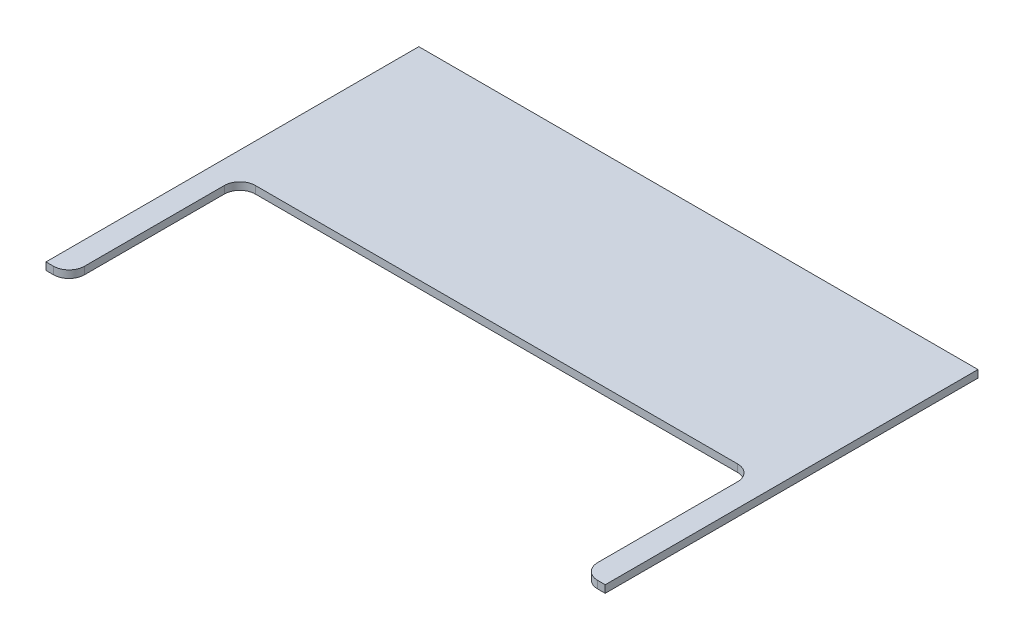
ISO-10303-21;
HEADER;
FILE_DESCRIPTION(('STEP AP214'),'2;1');
FILE_NAME('part.step','',(''),(''),'','','');
FILE_SCHEMA(('AUTOMOTIVE_DESIGN { 1 0 10303 214 1 1 1 1 }'));
ENDSEC;
DATA;
#1=APPLICATION_CONTEXT('core data for automotive mechanical design processes');
#2=APPLICATION_PROTOCOL_DEFINITION('international standard','automotive_design',2000,#1);
#3=PRODUCT_CONTEXT('',#1,'mechanical');
#4=PRODUCT('Part','Part','',(#3));
#5=PRODUCT_RELATED_PRODUCT_CATEGORY('part','',(#4));
#6=PRODUCT_DEFINITION_FORMATION('','',#4);
#7=PRODUCT_DEFINITION_CONTEXT('part definition',#1,'design');
#8=PRODUCT_DEFINITION('design','',#6,#7);
#9=PRODUCT_DEFINITION_SHAPE('','',#8);
#10=(LENGTH_UNIT() NAMED_UNIT(*) SI_UNIT(.MILLI.,.METRE.));
#11=(NAMED_UNIT(*) PLANE_ANGLE_UNIT() SI_UNIT($,.RADIAN.));
#12=(NAMED_UNIT(*) SI_UNIT($,.STERADIAN.) SOLID_ANGLE_UNIT());
#13=UNCERTAINTY_MEASURE_WITH_UNIT(LENGTH_MEASURE(1.E-05),#10,'distance_accuracy_value','');
#14=(GEOMETRIC_REPRESENTATION_CONTEXT(3) GLOBAL_UNCERTAINTY_ASSIGNED_CONTEXT((#13)) GLOBAL_UNIT_ASSIGNED_CONTEXT((#10,
#11,#12)) REPRESENTATION_CONTEXT('',''));
#15=CARTESIAN_POINT('',(0.,0.,0.));
#16=DIRECTION('',(0.,0.,1.));
#17=DIRECTION('',(1.,0.,0.));
#18=AXIS2_PLACEMENT_3D('',#15,#16,#17);
#19=CARTESIAN_POINT('',(-547.34693877551,12.,-337.959183673469));
#20=DIRECTION('',(1.,0.,0.));
#21=DIRECTION('',(0.,0.,-1.));
#22=AXIS2_PLACEMENT_3D('',#19,#20,#21);
#23=PLANE('',#22);
#24=DIRECTION('',(0.,0.,1.));
#25=VECTOR('',#24,1.);
#26=CARTESIAN_POINT('',(-547.34693877551,0.,-337.959183673469));
#27=LINE('',#26,#25);
#28=CARTESIAN_POINT('',(-547.34693877551,0.,-337.959183673469));
#29=VERTEX_POINT('',#28);
#30=CARTESIAN_POINT('',(-547.34693877551,0.,262.040816326531));
#31=VERTEX_POINT('',#30);
#32=EDGE_CURVE('E153',#29,#31,#27,.T.);
#33=ORIENTED_EDGE('',*,*,#32,.T.);
#34=DIRECTION('',(0.,-1.,0.));
#35=VECTOR('',#34,1.);
#36=CARTESIAN_POINT('',(-547.34693877551,12.,262.040816326531));
#37=LINE('',#36,#35);
#38=CARTESIAN_POINT('',(-547.34693877551,12.,262.040816326531));
#39=VERTEX_POINT('',#38);
#40=EDGE_CURVE('E11',#39,#31,#37,.T.);
#41=ORIENTED_EDGE('',*,*,#40,.F.);
#42=DIRECTION('',(0.,0.,1.));
#43=VECTOR('',#42,1.);
#44=CARTESIAN_POINT('',(-547.34693877551,12.,-337.959183673469));
#45=LINE('',#44,#43);
#46=CARTESIAN_POINT('',(-547.34693877551,12.,-337.959183673469));
#47=VERTEX_POINT('',#46);
#48=EDGE_CURVE('E175',#47,#39,#45,.T.);
#49=ORIENTED_EDGE('',*,*,#48,.F.);
#50=DIRECTION('',(0.,-1.,0.));
#51=VECTOR('',#50,1.);
#52=CARTESIAN_POINT('',(-547.34693877551,12.,-337.959183673469));
#53=LINE('',#52,#51);
#54=EDGE_CURVE('E149',#47,#29,#53,.T.);
#55=ORIENTED_EDGE('',*,*,#54,.T.);
#56=EDGE_LOOP('',(#33,#41,#49,#55));
#57=FACE_BOUND('',#56,.T.);
#58=ADVANCED_FACE('F33',(#57),#23,.F.);
#59=CARTESIAN_POINT('',(-547.34693877551,12.,262.040816326531));
#60=DIRECTION('',(0.,0.,-1.));
#61=DIRECTION('',(-1.,0.,0.));
#62=AXIS2_PLACEMENT_3D('',#59,#60,#61);
#63=PLANE('',#62);
#64=DIRECTION('',(1.,0.,0.));
#65=VECTOR('',#64,1.);
#66=CARTESIAN_POINT('',(-547.34693877551,0.,262.040816326531));
#67=LINE('',#66,#65);
#68=CARTESIAN_POINT('',(-535.34693877551,0.,262.040816326531));
#69=VERTEX_POINT('',#68);
#70=EDGE_CURVE('E156',#31,#69,#67,.T.);
#71=ORIENTED_EDGE('',*,*,#70,.T.);
#72=DIRECTION('',(0.,-1.,0.));
#73=VECTOR('',#72,1.);
#74=CARTESIAN_POINT('',(-535.34693877551,12.,262.040816326531));
#75=LINE('',#74,#73);
#76=CARTESIAN_POINT('',(-535.34693877551,12.,262.040816326531));
#77=VERTEX_POINT('',#76);
#78=EDGE_CURVE('E41',#77,#69,#75,.T.);
#79=ORIENTED_EDGE('',*,*,#78,.F.);
#80=DIRECTION('',(1.,0.,0.));
#81=VECTOR('',#80,1.);
#82=CARTESIAN_POINT('',(-547.34693877551,12.,262.040816326531));
#83=LINE('',#82,#81);
#84=EDGE_CURVE('E104',#39,#77,#83,.T.);
#85=ORIENTED_EDGE('',*,*,#84,.F.);
#86=ORIENTED_EDGE('',*,*,#40,.T.);
#87=EDGE_LOOP('',(#71,#79,#85,#86));
#88=FACE_BOUND('',#87,.T.);
#89=ADVANCED_FACE('F253',(#88),#63,.F.);
#90=CARTESIAN_POINT('',(-535.34693877551,12.,237.040816326531));
#91=DIRECTION('',(0.,-1.,0.));
#92=DIRECTION('',(0.,0.,-1.));
#93=AXIS2_PLACEMENT_3D('',#90,#91,#92);
#94=CYLINDRICAL_SURFACE('',#93,25.);
#95=CARTESIAN_POINT('',(-535.34693877551,0.,237.040816326531));
#96=DIRECTION('',(0.,1.,0.));
#97=DIRECTION('',(0.,0.,-1.));
#98=AXIS2_PLACEMENT_3D('',#95,#96,#97);
#99=CIRCLE('',#98,25.);
#100=CARTESIAN_POINT('',(-510.34693877551,0.,237.04081632653));
#101=VERTEX_POINT('',#100);
#102=EDGE_CURVE('E158',#69,#101,#99,.T.);
#103=ORIENTED_EDGE('',*,*,#102,.T.);
#104=DIRECTION('',(0.,-1.,0.));
#105=VECTOR('',#104,1.);
#106=CARTESIAN_POINT('',(-510.34693877551,12.,237.04081632653));
#107=LINE('',#106,#105);
#108=CARTESIAN_POINT('',(-510.34693877551,12.,237.04081632653));
#109=VERTEX_POINT('',#108);
#110=EDGE_CURVE('E194',#109,#101,#107,.T.);
#111=ORIENTED_EDGE('',*,*,#110,.F.);
#112=CARTESIAN_POINT('',(-535.34693877551,12.,237.040816326531));
#113=DIRECTION('',(0.,1.,0.));
#114=DIRECTION('',(0.,0.,-1.));
#115=AXIS2_PLACEMENT_3D('',#112,#113,#114);
#116=CIRCLE('',#115,25.);
#117=EDGE_CURVE('E202',#77,#109,#116,.T.);
#118=ORIENTED_EDGE('',*,*,#117,.F.);
#119=ORIENTED_EDGE('',*,*,#78,.T.);
#120=EDGE_LOOP('',(#103,#111,#118,#119));
#121=FACE_BOUND('',#120,.T.);
#122=ADVANCED_FACE('F200',(#121),#94,.T.);
#123=CARTESIAN_POINT('',(-510.34693877551,12.,237.04081632653));
#124=DIRECTION('',(-1.,0.,0.));
#125=DIRECTION('',(0.,0.,1.));
#126=AXIS2_PLACEMENT_3D('',#123,#124,#125);
#127=PLANE('',#126);
#128=DIRECTION('',(0.,0.,-1.));
#129=VECTOR('',#128,1.);
#130=CARTESIAN_POINT('',(-510.34693877551,0.,237.04081632653));
#131=LINE('',#130,#129);
#132=CARTESIAN_POINT('',(-510.34693877551,0.,12.0408163265306));
#133=VERTEX_POINT('',#132);
#134=EDGE_CURVE('E160',#101,#133,#131,.T.);
#135=ORIENTED_EDGE('',*,*,#134,.T.);
#136=DIRECTION('',(0.,-1.,0.));
#137=VECTOR('',#136,1.);
#138=CARTESIAN_POINT('',(-510.34693877551,12.,12.0408163265306));
#139=LINE('',#138,#137);
#140=CARTESIAN_POINT('',(-510.34693877551,12.,12.0408163265306));
#141=VERTEX_POINT('',#140);
#142=EDGE_CURVE('E191',#141,#133,#139,.T.);
#143=ORIENTED_EDGE('',*,*,#142,.F.);
#144=DIRECTION('',(0.,0.,-1.));
#145=VECTOR('',#144,1.);
#146=CARTESIAN_POINT('',(-510.34693877551,12.,237.04081632653));
#147=LINE('',#146,#145);
#148=EDGE_CURVE('E220',#109,#141,#147,.T.);
#149=ORIENTED_EDGE('',*,*,#148,.F.);
#150=ORIENTED_EDGE('',*,*,#110,.T.);
#151=EDGE_LOOP('',(#135,#143,#149,#150));
#152=FACE_BOUND('',#151,.T.);
#153=ADVANCED_FACE('F211',(#152),#127,.F.);
#154=CARTESIAN_POINT('',(-485.34693877551,12.,12.0408163265304));
#155=DIRECTION('',(0.,-1.,0.));
#156=DIRECTION('',(0.,0.,-1.));
#157=AXIS2_PLACEMENT_3D('',#154,#155,#156);
#158=CYLINDRICAL_SURFACE('',#157,25.);
#159=CARTESIAN_POINT('',(-485.34693877551,0.,12.0408163265304));
#160=DIRECTION('',(0.,-1.,0.));
#161=DIRECTION('',(0.,0.,-1.));
#162=AXIS2_PLACEMENT_3D('',#159,#160,#161);
#163=CIRCLE('',#162,25.);
#164=CARTESIAN_POINT('',(-485.34693877551,0.,-12.9591836734696));
#165=VERTEX_POINT('',#164);
#166=EDGE_CURVE('E162',#133,#165,#163,.T.);
#167=ORIENTED_EDGE('',*,*,#166,.T.);
#168=DIRECTION('',(0.,-1.,0.));
#169=VECTOR('',#168,1.);
#170=CARTESIAN_POINT('',(-485.34693877551,12.,-12.9591836734696));
#171=LINE('',#170,#169);
#172=CARTESIAN_POINT('',(-485.34693877551,12.,-12.9591836734696));
#173=VERTEX_POINT('',#172);
#174=EDGE_CURVE('E188',#173,#165,#171,.T.);
#175=ORIENTED_EDGE('',*,*,#174,.F.);
#176=CARTESIAN_POINT('',(-485.34693877551,12.,12.0408163265304));
#177=DIRECTION('',(0.,-1.,0.));
#178=DIRECTION('',(0.,0.,-1.));
#179=AXIS2_PLACEMENT_3D('',#176,#177,#178);
#180=CIRCLE('',#179,25.);
#181=EDGE_CURVE('E217',#141,#173,#180,.T.);
#182=ORIENTED_EDGE('',*,*,#181,.F.);
#183=ORIENTED_EDGE('',*,*,#142,.T.);
#184=EDGE_LOOP('',(#167,#175,#182,#183));
#185=FACE_BOUND('',#184,.T.);
#186=ADVANCED_FACE('F215',(#185),#158,.F.);
#187=CARTESIAN_POINT('',(-485.34693877551,12.,-12.9591836734696));
#188=DIRECTION('',(0.,0.,-1.));
#189=DIRECTION('',(-1.,0.,0.));
#190=AXIS2_PLACEMENT_3D('',#187,#188,#189);
#191=PLANE('',#190);
#192=DIRECTION('',(1.,0.,0.));
#193=VECTOR('',#192,1.);
#194=CARTESIAN_POINT('',(-485.34693877551,0.,-12.9591836734696));
#195=LINE('',#194,#193);
#196=CARTESIAN_POINT('',(290.65306122449,0.,-12.9591836734696));
#197=VERTEX_POINT('',#196);
#198=EDGE_CURVE('E164',#165,#197,#195,.T.);
#199=ORIENTED_EDGE('',*,*,#198,.T.);
#200=DIRECTION('',(0.,-1.,0.));
#201=VECTOR('',#200,1.);
#202=CARTESIAN_POINT('',(290.65306122449,12.,-12.9591836734696));
#203=LINE('',#202,#201);
#204=CARTESIAN_POINT('',(290.65306122449,12.,-12.9591836734696));
#205=VERTEX_POINT('',#204);
#206=EDGE_CURVE('E185',#205,#197,#203,.T.);
#207=ORIENTED_EDGE('',*,*,#206,.F.);
#208=DIRECTION('',(1.,0.,0.));
#209=VECTOR('',#208,1.);
#210=CARTESIAN_POINT('',(-485.34693877551,12.,-12.9591836734696));
#211=LINE('',#210,#209);
#212=EDGE_CURVE('E219',#173,#205,#211,.T.);
#213=ORIENTED_EDGE('',*,*,#212,.F.);
#214=ORIENTED_EDGE('',*,*,#174,.T.);
#215=EDGE_LOOP('',(#199,#207,#213,#214));
#216=FACE_BOUND('',#215,.T.);
#217=ADVANCED_FACE('F266',(#216),#191,.F.);
#218=CARTESIAN_POINT('',(290.65306122449,12.,12.0408163265304));
#219=DIRECTION('',(0.,-1.,0.));
#220=DIRECTION('',(0.,0.,-1.));
#221=AXIS2_PLACEMENT_3D('',#218,#219,#220);
#222=CYLINDRICAL_SURFACE('',#221,25.);
#223=CARTESIAN_POINT('',(290.65306122449,0.,12.0408163265304));
#224=DIRECTION('',(0.,-1.,0.));
#225=DIRECTION('',(0.,0.,-1.));
#226=AXIS2_PLACEMENT_3D('',#223,#224,#225);
#227=CIRCLE('',#226,25.);
#228=CARTESIAN_POINT('',(315.65306122449,0.,12.0408163265306));
#229=VERTEX_POINT('',#228);
#230=EDGE_CURVE('E166',#197,#229,#227,.T.);
#231=ORIENTED_EDGE('',*,*,#230,.T.);
#232=DIRECTION('',(0.,-1.,0.));
#233=VECTOR('',#232,1.);
#234=CARTESIAN_POINT('',(315.65306122449,12.,12.0408163265306));
#235=LINE('',#234,#233);
#236=CARTESIAN_POINT('',(315.65306122449,12.,12.0408163265306));
#237=VERTEX_POINT('',#236);
#238=EDGE_CURVE('E182',#237,#229,#235,.T.);
#239=ORIENTED_EDGE('',*,*,#238,.F.);
#240=CARTESIAN_POINT('',(290.65306122449,12.,12.0408163265304));
#241=DIRECTION('',(0.,-1.,0.));
#242=DIRECTION('',(0.,0.,-1.));
#243=AXIS2_PLACEMENT_3D('',#240,#241,#242);
#244=CIRCLE('',#243,25.);
#245=EDGE_CURVE('E222',#205,#237,#244,.T.);
#246=ORIENTED_EDGE('',*,*,#245,.F.);
#247=ORIENTED_EDGE('',*,*,#206,.T.);
#248=EDGE_LOOP('',(#231,#239,#246,#247));
#249=FACE_BOUND('',#248,.T.);
#250=ADVANCED_FACE('F269',(#249),#222,.F.);
#251=CARTESIAN_POINT('',(315.65306122449,12.,12.0408163265306));
#252=DIRECTION('',(1.,0.,0.));
#253=DIRECTION('',(0.,0.,-1.));
#254=AXIS2_PLACEMENT_3D('',#251,#252,#253);
#255=PLANE('',#254);
#256=DIRECTION('',(0.,0.,1.));
#257=VECTOR('',#256,1.);
#258=CARTESIAN_POINT('',(315.65306122449,0.,12.0408163265306));
#259=LINE('',#258,#257);
#260=CARTESIAN_POINT('',(315.65306122449,0.,237.04081632653));
#261=VERTEX_POINT('',#260);
#262=EDGE_CURVE('E168',#229,#261,#259,.T.);
#263=ORIENTED_EDGE('',*,*,#262,.T.);
#264=DIRECTION('',(0.,-1.,0.));
#265=VECTOR('',#264,1.);
#266=CARTESIAN_POINT('',(315.65306122449,12.,237.04081632653));
#267=LINE('',#266,#265);
#268=CARTESIAN_POINT('',(315.65306122449,12.,237.04081632653));
#269=VERTEX_POINT('',#268);
#270=EDGE_CURVE('E179',#269,#261,#267,.T.);
#271=ORIENTED_EDGE('',*,*,#270,.F.);
#272=DIRECTION('',(0.,0.,1.));
#273=VECTOR('',#272,1.);
#274=CARTESIAN_POINT('',(315.65306122449,12.,12.0408163265306));
#275=LINE('',#274,#273);
#276=EDGE_CURVE('E228',#237,#269,#275,.T.);
#277=ORIENTED_EDGE('',*,*,#276,.F.);
#278=ORIENTED_EDGE('',*,*,#238,.T.);
#279=EDGE_LOOP('',(#263,#271,#277,#278));
#280=FACE_BOUND('',#279,.T.);
#281=ADVANCED_FACE('F234',(#280),#255,.F.);
#282=CARTESIAN_POINT('',(340.65306122449,12.,237.040816326531));
#283=DIRECTION('',(0.,-1.,0.));
#284=DIRECTION('',(0.,0.,-1.));
#285=AXIS2_PLACEMENT_3D('',#282,#283,#284);
#286=CYLINDRICAL_SURFACE('',#285,25.);
#287=CARTESIAN_POINT('',(340.65306122449,0.,237.040816326531));
#288=DIRECTION('',(0.,1.,0.));
#289=DIRECTION('',(0.,0.,-1.));
#290=AXIS2_PLACEMENT_3D('',#287,#288,#289);
#291=CIRCLE('',#290,25.);
#292=CARTESIAN_POINT('',(340.65306122449,0.,262.040816326531));
#293=VERTEX_POINT('',#292);
#294=EDGE_CURVE('E170',#261,#293,#291,.T.);
#295=ORIENTED_EDGE('',*,*,#294,.T.);
#296=DIRECTION('',(0.,-1.,0.));
#297=VECTOR('',#296,1.);
#298=CARTESIAN_POINT('',(340.65306122449,12.,262.040816326531));
#299=LINE('',#298,#297);
#300=CARTESIAN_POINT('',(340.65306122449,12.,262.040816326531));
#301=VERTEX_POINT('',#300);
#302=EDGE_CURVE('E144',#301,#293,#299,.T.);
#303=ORIENTED_EDGE('',*,*,#302,.F.);
#304=CARTESIAN_POINT('',(340.65306122449,12.,237.040816326531));
#305=DIRECTION('',(0.,1.,0.));
#306=DIRECTION('',(0.,0.,-1.));
#307=AXIS2_PLACEMENT_3D('',#304,#305,#306);
#308=CIRCLE('',#307,25.);
#309=EDGE_CURVE('E135',#269,#301,#308,.T.);
#310=ORIENTED_EDGE('',*,*,#309,.F.);
#311=ORIENTED_EDGE('',*,*,#270,.T.);
#312=EDGE_LOOP('',(#295,#303,#310,#311));
#313=FACE_BOUND('',#312,.T.);
#314=ADVANCED_FACE('F238',(#313),#286,.T.);
#315=CARTESIAN_POINT('',(340.65306122449,12.,262.040816326531));
#316=DIRECTION('',(0.,0.,-1.));
#317=DIRECTION('',(-1.,0.,0.));
#318=AXIS2_PLACEMENT_3D('',#315,#316,#317);
#319=PLANE('',#318);
#320=DIRECTION('',(1.,0.,0.));
#321=VECTOR('',#320,1.);
#322=CARTESIAN_POINT('',(340.65306122449,0.,262.040816326531));
#323=LINE('',#322,#321);
#324=CARTESIAN_POINT('',(352.65306122449,0.,262.040816326531));
#325=VERTEX_POINT('',#324);
#326=EDGE_CURVE('E143',#293,#325,#323,.T.);
#327=ORIENTED_EDGE('',*,*,#326,.T.);
#328=DIRECTION('',(0.,-1.,0.));
#329=VECTOR('',#328,1.);
#330=CARTESIAN_POINT('',(352.65306122449,12.,262.040816326531));
#331=LINE('',#330,#329);
#332=CARTESIAN_POINT('',(352.65306122449,12.,262.040816326531));
#333=VERTEX_POINT('',#332);
#334=EDGE_CURVE('E140',#333,#325,#331,.T.);
#335=ORIENTED_EDGE('',*,*,#334,.F.);
#336=DIRECTION('',(1.,0.,0.));
#337=VECTOR('',#336,1.);
#338=CARTESIAN_POINT('',(340.65306122449,12.,262.040816326531));
#339=LINE('',#338,#337);
#340=EDGE_CURVE('E129',#301,#333,#339,.T.);
#341=ORIENTED_EDGE('',*,*,#340,.F.);
#342=ORIENTED_EDGE('',*,*,#302,.T.);
#343=EDGE_LOOP('',(#327,#335,#341,#342));
#344=FACE_BOUND('',#343,.T.);
#345=ADVANCED_FACE('F141',(#344),#319,.F.);
#346=CARTESIAN_POINT('',(352.65306122449,12.,-337.959183673469));
#347=DIRECTION('',(-1.,0.,0.));
#348=DIRECTION('',(0.,0.,1.));
#349=AXIS2_PLACEMENT_3D('',#346,#347,#348);
#350=PLANE('',#349);
#351=DIRECTION('',(0.,0.,-1.));
#352=VECTOR('',#351,1.);
#353=CARTESIAN_POINT('',(352.65306122449,0.,-337.959183673469));
#354=LINE('',#353,#352);
#355=CARTESIAN_POINT('',(352.65306122449,0.,-337.959183673469));
#356=VERTEX_POINT('',#355);
#357=EDGE_CURVE('E90',#325,#356,#354,.T.);
#358=ORIENTED_EDGE('',*,*,#357,.T.);
#359=DIRECTION('',(0.,-1.,0.));
#360=VECTOR('',#359,1.);
#361=CARTESIAN_POINT('',(352.65306122449,12.,-337.959183673469));
#362=LINE('',#361,#360);
#363=CARTESIAN_POINT('',(352.65306122449,12.,-337.959183673469));
#364=VERTEX_POINT('',#363);
#365=EDGE_CURVE('E145',#364,#356,#362,.T.);
#366=ORIENTED_EDGE('',*,*,#365,.F.);
#367=DIRECTION('',(0.,0.,-1.));
#368=VECTOR('',#367,1.);
#369=CARTESIAN_POINT('',(352.65306122449,12.,-337.959183673469));
#370=LINE('',#369,#368);
#371=EDGE_CURVE('E133',#333,#364,#370,.T.);
#372=ORIENTED_EDGE('',*,*,#371,.F.);
#373=ORIENTED_EDGE('',*,*,#334,.T.);
#374=EDGE_LOOP('',(#358,#366,#372,#373));
#375=FACE_BOUND('',#374,.T.);
#376=ADVANCED_FACE('F147',(#375),#350,.F.);
#377=CARTESIAN_POINT('',(-547.34693877551,12.,-337.959183673469));
#378=DIRECTION('',(0.,0.,1.));
#379=DIRECTION('',(1.,0.,0.));
#380=AXIS2_PLACEMENT_3D('',#377,#378,#379);
#381=PLANE('',#380);
#382=DIRECTION('',(-1.,0.,0.));
#383=VECTOR('',#382,1.);
#384=CARTESIAN_POINT('',(-547.34693877551,0.,-337.959183673469));
#385=LINE('',#384,#383);
#386=EDGE_CURVE('E96',#356,#29,#385,.T.);
#387=ORIENTED_EDGE('',*,*,#386,.T.);
#388=ORIENTED_EDGE('',*,*,#54,.F.);
#389=DIRECTION('',(-1.,0.,0.));
#390=VECTOR('',#389,1.);
#391=CARTESIAN_POINT('',(-547.34693877551,12.,-337.959183673469));
#392=LINE('',#391,#390);
#393=EDGE_CURVE('E49',#364,#47,#392,.T.);
#394=ORIENTED_EDGE('',*,*,#393,.F.);
#395=ORIENTED_EDGE('',*,*,#365,.T.);
#396=EDGE_LOOP('',(#387,#388,#394,#395));
#397=FACE_BOUND('',#396,.T.);
#398=ADVANCED_FACE('F242',(#397),#381,.F.);
#399=CARTESIAN_POINT('',(-535.34693877551,12.,237.040816326531));
#400=DIRECTION('',(0.,-1.,0.));
#401=DIRECTION('',(0.,0.,-1.));
#402=AXIS2_PLACEMENT_3D('',#399,#400,#401);
#403=PLANE('',#402);
#404=ORIENTED_EDGE('',*,*,#48,.T.);
#405=ORIENTED_EDGE('',*,*,#84,.T.);
#406=ORIENTED_EDGE('',*,*,#117,.T.);
#407=ORIENTED_EDGE('',*,*,#148,.T.);
#408=ORIENTED_EDGE('',*,*,#181,.T.);
#409=ORIENTED_EDGE('',*,*,#212,.T.);
#410=ORIENTED_EDGE('',*,*,#245,.T.);
#411=ORIENTED_EDGE('',*,*,#276,.T.);
#412=ORIENTED_EDGE('',*,*,#309,.T.);
#413=ORIENTED_EDGE('',*,*,#340,.T.);
#414=ORIENTED_EDGE('',*,*,#371,.T.);
#415=ORIENTED_EDGE('',*,*,#393,.T.);
#416=EDGE_LOOP('',(#404,#405,#406,#407,#408,#409,#410,#411,#412,#413,#414,#415));
#417=FACE_BOUND('',#416,.T.);
#418=ADVANCED_FACE('F131',(#417),#403,.F.);
#419=CARTESIAN_POINT('',(-535.34693877551,0.,237.040816326531));
#420=DIRECTION('',(0.,-1.,0.));
#421=DIRECTION('',(0.,0.,-1.));
#422=AXIS2_PLACEMENT_3D('',#419,#420,#421);
#423=PLANE('',#422);
#424=ORIENTED_EDGE('',*,*,#32,.F.);
#425=ORIENTED_EDGE('',*,*,#386,.F.);
#426=ORIENTED_EDGE('',*,*,#357,.F.);
#427=ORIENTED_EDGE('',*,*,#326,.F.);
#428=ORIENTED_EDGE('',*,*,#294,.F.);
#429=ORIENTED_EDGE('',*,*,#262,.F.);
#430=ORIENTED_EDGE('',*,*,#230,.F.);
#431=ORIENTED_EDGE('',*,*,#198,.F.);
#432=ORIENTED_EDGE('',*,*,#166,.F.);
#433=ORIENTED_EDGE('',*,*,#134,.F.);
#434=ORIENTED_EDGE('',*,*,#102,.F.);
#435=ORIENTED_EDGE('',*,*,#70,.F.);
#436=EDGE_LOOP('',(#424,#425,#426,#427,#428,#429,#430,#431,#432,#433,#434,#435));
#437=FACE_BOUND('',#436,.T.);
#438=ADVANCED_FACE('F206',(#437),#423,.T.);
#439=CLOSED_SHELL('',(#58,#89,#122,#153,#186,#217,#250,#281,#314,#345,#376,#398,#418,#438));
#440=MANIFOLD_SOLID_BREP('B2',#439);
#441=ADVANCED_BREP_SHAPE_REPRESENTATION('',(#18,#440),#14);
#442=SHAPE_DEFINITION_REPRESENTATION(#9,#441);
ENDSEC;
END-ISO-10303-21;
